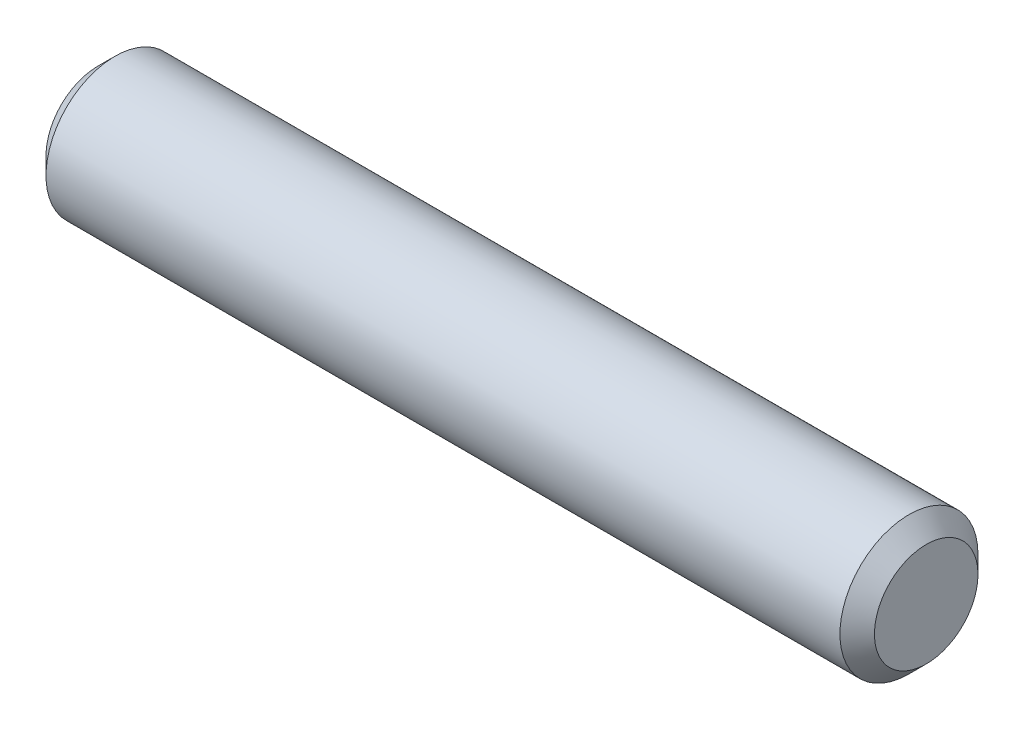
ISO-10303-21;
HEADER;
FILE_DESCRIPTION(('STEP AP214'),'2;1');
FILE_NAME('part.step','',(''),(''),'','','');
FILE_SCHEMA(('AUTOMOTIVE_DESIGN { 1 0 10303 214 1 1 1 1 }'));
ENDSEC;
DATA;
#1=APPLICATION_CONTEXT('core data for automotive mechanical design processes');
#2=APPLICATION_PROTOCOL_DEFINITION('international standard','automotive_design',2000,#1);
#3=PRODUCT_CONTEXT('',#1,'mechanical');
#4=PRODUCT('Part','Part','',(#3));
#5=PRODUCT_RELATED_PRODUCT_CATEGORY('part','',(#4));
#6=PRODUCT_DEFINITION_FORMATION('','',#4);
#7=PRODUCT_DEFINITION_CONTEXT('part definition',#1,'design');
#8=PRODUCT_DEFINITION('design','',#6,#7);
#9=PRODUCT_DEFINITION_SHAPE('','',#8);
#10=(LENGTH_UNIT() NAMED_UNIT(*) SI_UNIT(.MILLI.,.METRE.));
#11=(NAMED_UNIT(*) PLANE_ANGLE_UNIT() SI_UNIT($,.RADIAN.));
#12=(NAMED_UNIT(*) SI_UNIT($,.STERADIAN.) SOLID_ANGLE_UNIT());
#13=UNCERTAINTY_MEASURE_WITH_UNIT(LENGTH_MEASURE(1.E-05),#10,'distance_accuracy_value','');
#14=(GEOMETRIC_REPRESENTATION_CONTEXT(3) GLOBAL_UNCERTAINTY_ASSIGNED_CONTEXT((#13)) GLOBAL_UNIT_ASSIGNED_CONTEXT((#10,
#11,#12)) REPRESENTATION_CONTEXT('',''));
#15=CARTESIAN_POINT('',(0.,0.,0.));
#16=DIRECTION('',(0.,0.,1.));
#17=DIRECTION('',(1.,0.,0.));
#18=AXIS2_PLACEMENT_3D('',#15,#16,#17);
#19=CARTESIAN_POINT('',(12.,0.,0.));
#20=DIRECTION('',(-1.,0.,0.));
#21=DIRECTION('',(0.,0.,1.));
#22=AXIS2_PLACEMENT_3D('',#19,#20,#21);
#23=CYLINDRICAL_SURFACE('',#22,2.);
#24=CARTESIAN_POINT('',(-11.5,0.,0.));
#25=DIRECTION('',(1.,0.,0.));
#26=DIRECTION('',(0.,0.,-1.));
#27=AXIS2_PLACEMENT_3D('',#24,#25,#26);
#28=CIRCLE('',#27,2.);
#29=CARTESIAN_POINT('',(-11.5,0.,-2.));
#30=VERTEX_POINT('',#29);
#31=EDGE_CURVE('E59',#30,#30,#28,.T.);
#32=ORIENTED_EDGE('',*,*,#31,.T.);
#33=EDGE_LOOP('',(#32));
#34=FACE_BOUND('',#33,.T.);
#35=CARTESIAN_POINT('',(11.5,0.,0.));
#36=DIRECTION('',(1.,0.,0.));
#37=DIRECTION('',(0.,0.,-1.));
#38=AXIS2_PLACEMENT_3D('',#35,#36,#37);
#39=CIRCLE('',#38,2.);
#40=CARTESIAN_POINT('',(11.5,0.,-2.));
#41=VERTEX_POINT('',#40);
#42=EDGE_CURVE('E64',#41,#41,#39,.F.);
#43=ORIENTED_EDGE('',*,*,#42,.T.);
#44=EDGE_LOOP('',(#43));
#45=FACE_BOUND('',#44,.T.);
#46=ADVANCED_FACE('F45',(#34,#45),#23,.T.);
#47=CARTESIAN_POINT('',(12.,0.,0.));
#48=DIRECTION('',(1.,0.,0.));
#49=DIRECTION('',(0.,0.,-1.));
#50=AXIS2_PLACEMENT_3D('',#47,#48,#49);
#51=PLANE('',#50);
#52=CARTESIAN_POINT('',(12.,0.,0.));
#53=DIRECTION('',(1.,0.,0.));
#54=DIRECTION('',(0.,0.,-1.));
#55=AXIS2_PLACEMENT_3D('',#52,#53,#54);
#56=CIRCLE('',#55,1.5);
#57=CARTESIAN_POINT('',(12.,0.,-1.5));
#58=VERTEX_POINT('',#57);
#59=EDGE_CURVE('E10',#58,#58,#56,.T.);
#60=ORIENTED_EDGE('',*,*,#59,.T.);
#61=EDGE_LOOP('',(#60));
#62=FACE_BOUND('',#61,.T.);
#63=ADVANCED_FACE('F81',(#62),#51,.T.);
#64=CARTESIAN_POINT('',(-12.,0.,0.));
#65=DIRECTION('',(1.,0.,0.));
#66=DIRECTION('',(0.,0.,-1.));
#67=AXIS2_PLACEMENT_3D('',#64,#65,#66);
#68=PLANE('',#67);
#69=CARTESIAN_POINT('',(-12.,0.,0.));
#70=DIRECTION('',(1.,0.,0.));
#71=DIRECTION('',(0.,0.,-1.));
#72=AXIS2_PLACEMENT_3D('',#69,#70,#71);
#73=CIRCLE('',#72,1.49999999999999);
#74=CARTESIAN_POINT('',(-12.,0.,-1.49999999999999));
#75=VERTEX_POINT('',#74);
#76=EDGE_CURVE('E54',#75,#75,#73,.F.);
#77=ORIENTED_EDGE('',*,*,#76,.T.);
#78=EDGE_LOOP('',(#77));
#79=FACE_BOUND('',#78,.T.);
#80=ADVANCED_FACE('F78',(#79),#68,.F.);
#81=CARTESIAN_POINT('',(-11.5,0.,0.));
#82=DIRECTION('',(1.,0.,0.));
#83=DIRECTION('',(0.,0.,-1.));
#84=AXIS2_PLACEMENT_3D('',#81,#82,#83);
#85=CONICAL_SURFACE('',#84,2.,0.78539816339745);
#86=ORIENTED_EDGE('',*,*,#76,.F.);
#87=EDGE_LOOP('',(#86));
#88=FACE_BOUND('',#87,.T.);
#89=ORIENTED_EDGE('',*,*,#31,.F.);
#90=EDGE_LOOP('',(#89));
#91=FACE_BOUND('',#90,.T.);
#92=ADVANCED_FACE('F74',(#88,#91),#85,.T.);
#93=CARTESIAN_POINT('',(12.,0.,0.));
#94=DIRECTION('',(-1.,0.,0.));
#95=DIRECTION('',(0.,0.,1.));
#96=AXIS2_PLACEMENT_3D('',#93,#94,#95);
#97=CONICAL_SURFACE('',#96,1.5,0.785398163397444);
#98=ORIENTED_EDGE('',*,*,#42,.F.);
#99=EDGE_LOOP('',(#98));
#100=FACE_BOUND('',#99,.T.);
#101=ORIENTED_EDGE('',*,*,#59,.F.);
#102=EDGE_LOOP('',(#101));
#103=FACE_BOUND('',#102,.T.);
#104=ADVANCED_FACE('F48',(#100,#103),#97,.T.);
#105=CLOSED_SHELL('',(#46,#63,#80,#92,#104));
#106=MANIFOLD_SOLID_BREP('B2',#105);
#107=ADVANCED_BREP_SHAPE_REPRESENTATION('',(#18,#106),#14);
#108=SHAPE_DEFINITION_REPRESENTATION(#9,#107);
ENDSEC;
END-ISO-10303-21;
